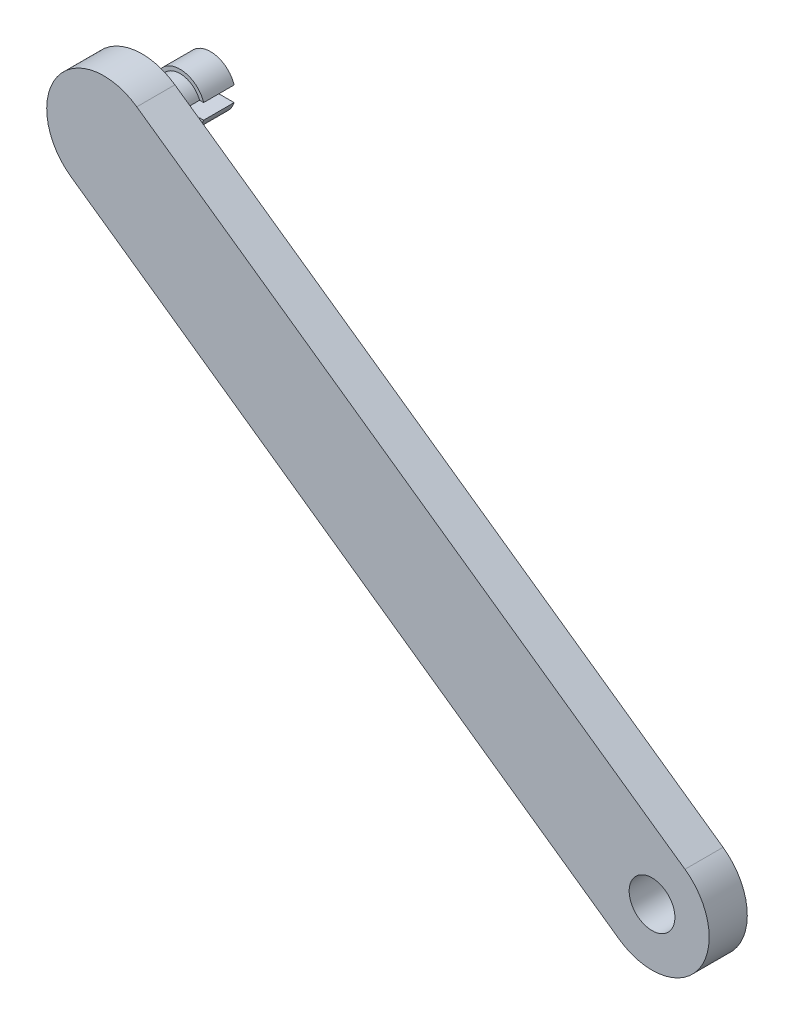
ISO-10303-21;
HEADER;
FILE_DESCRIPTION(('STEP AP214'),'2;1');
FILE_NAME('part.step','',(''),(''),'','','');
FILE_SCHEMA(('AUTOMOTIVE_DESIGN { 1 0 10303 214 1 1 1 1 }'));
ENDSEC;
DATA;
#1=APPLICATION_CONTEXT('core data for automotive mechanical design processes');
#2=APPLICATION_PROTOCOL_DEFINITION('international standard','automotive_design',2000,#1);
#3=PRODUCT_CONTEXT('',#1,'mechanical');
#4=PRODUCT('Part','Part','',(#3));
#5=PRODUCT_RELATED_PRODUCT_CATEGORY('part','',(#4));
#6=PRODUCT_DEFINITION_FORMATION('','',#4);
#7=PRODUCT_DEFINITION_CONTEXT('part definition',#1,'design');
#8=PRODUCT_DEFINITION('design','',#6,#7);
#9=PRODUCT_DEFINITION_SHAPE('','',#8);
#10=(LENGTH_UNIT() NAMED_UNIT(*) SI_UNIT(.MILLI.,.METRE.));
#11=(NAMED_UNIT(*) PLANE_ANGLE_UNIT() SI_UNIT($,.RADIAN.));
#12=(NAMED_UNIT(*) SI_UNIT($,.STERADIAN.) SOLID_ANGLE_UNIT());
#13=UNCERTAINTY_MEASURE_WITH_UNIT(LENGTH_MEASURE(1.E-05),#10,'distance_accuracy_value','');
#14=(GEOMETRIC_REPRESENTATION_CONTEXT(3) GLOBAL_UNCERTAINTY_ASSIGNED_CONTEXT((#13)) GLOBAL_UNIT_ASSIGNED_CONTEXT((#10,
#11,#12)) REPRESENTATION_CONTEXT('',''));
#15=CARTESIAN_POINT('',(0.,0.,0.));
#16=DIRECTION('',(0.,0.,1.));
#17=DIRECTION('',(1.,0.,0.));
#18=AXIS2_PLACEMENT_3D('',#15,#16,#17);
#19=CARTESIAN_POINT('',(-51.9374003115642,50.6854065428479,-5.));
#20=DIRECTION('',(0.,0.,1.));
#21=DIRECTION('',(1.,0.,0.));
#22=AXIS2_PLACEMENT_3D('',#19,#20,#21);
#23=CYLINDRICAL_SURFACE('',#22,2.75000000000001);
#24=CARTESIAN_POINT('',(-51.9374003115642,50.6854065428479,-5.));
#25=DIRECTION('',(0.,0.,-1.));
#26=DIRECTION('',(-1.,0.,0.));
#27=AXIS2_PLACEMENT_3D('',#24,#25,#26);
#28=CIRCLE('',#27,2.75000000000001);
#29=CARTESIAN_POINT('',(-54.4991380030541,51.6854065428479,-5.));
#30=VERTEX_POINT('',#29);
#31=CARTESIAN_POINT('',(-49.3756626200743,51.6854065428479,-5.));
#32=VERTEX_POINT('',#31);
#33=EDGE_CURVE('E166',#30,#32,#28,.T.);
#34=ORIENTED_EDGE('',*,*,#33,.F.);
#35=DIRECTION('',(0.,0.,1.));
#36=VECTOR('',#35,1.);
#37=CARTESIAN_POINT('',(-54.4991380030541,51.6854065428479,-5.));
#38=LINE('',#37,#36);
#39=CARTESIAN_POINT('',(-54.4991380030541,51.6854065428479,0.));
#40=VERTEX_POINT('',#39);
#41=EDGE_CURVE('E163',#30,#40,#38,.T.);
#42=ORIENTED_EDGE('',*,*,#41,.T.);
#43=CARTESIAN_POINT('',(-51.9374003115642,50.6854065428479,0.));
#44=DIRECTION('',(0.,0.,1.));
#45=DIRECTION('',(1.,0.,0.));
#46=AXIS2_PLACEMENT_3D('',#43,#44,#45);
#47=CIRCLE('',#46,2.75000000000001);
#48=CARTESIAN_POINT('',(-49.3756626200743,51.6854065428479,0.));
#49=VERTEX_POINT('',#48);
#50=EDGE_CURVE('E198',#40,#49,#47,.F.);
#51=ORIENTED_EDGE('',*,*,#50,.T.);
#52=DIRECTION('',(0.,0.,1.));
#53=VECTOR('',#52,1.);
#54=CARTESIAN_POINT('',(-49.3756626200743,51.6854065428479,-5.));
#55=LINE('',#54,#53);
#56=EDGE_CURVE('E220',#49,#32,#55,.F.);
#57=ORIENTED_EDGE('',*,*,#56,.T.);
#58=EDGE_LOOP('',(#34,#42,#51,#57));
#59=FACE_BOUND('',#58,.T.);
#60=ADVANCED_FACE('F37',(#59),#23,.T.);
#61=CARTESIAN_POINT('',(-51.9374003115642,50.6854065428479,-9.));
#62=DIRECTION('',(0.,0.,1.));
#63=DIRECTION('',(1.,0.,0.));
#64=AXIS2_PLACEMENT_3D('',#61,#62,#63);
#65=CYLINDRICAL_SURFACE('',#64,3.25000000000001);
#66=CARTESIAN_POINT('',(-51.9374003115642,50.6854065428479,-9.));
#67=DIRECTION('',(0.,0.,-1.));
#68=DIRECTION('',(-1.,0.,0.));
#69=AXIS2_PLACEMENT_3D('',#66,#67,#68);
#70=CIRCLE('',#69,3.25000000000001);
#71=CARTESIAN_POINT('',(-55.0297295307774,51.6854065428479,-9.));
#72=VERTEX_POINT('',#71);
#73=CARTESIAN_POINT('',(-48.8450710923509,51.6854065428479,-9.));
#74=VERTEX_POINT('',#73);
#75=EDGE_CURVE('E154',#72,#74,#70,.T.);
#76=ORIENTED_EDGE('',*,*,#75,.F.);
#77=DIRECTION('',(0.,0.,1.));
#78=VECTOR('',#77,1.);
#79=CARTESIAN_POINT('',(-55.0297295307774,51.6854065428479,-9.));
#80=LINE('',#79,#78);
#81=CARTESIAN_POINT('',(-55.0297295307774,51.6854065428479,-5.));
#82=VERTEX_POINT('',#81);
#83=EDGE_CURVE('E218',#72,#82,#80,.T.);
#84=ORIENTED_EDGE('',*,*,#83,.T.);
#85=CARTESIAN_POINT('',(-51.9374003115642,50.6854065428479,-5.));
#86=DIRECTION('',(0.,0.,-1.));
#87=DIRECTION('',(-1.,0.,0.));
#88=AXIS2_PLACEMENT_3D('',#85,#86,#87);
#89=CIRCLE('',#88,3.25000000000001);
#90=CARTESIAN_POINT('',(-48.8450710923509,51.6854065428479,-5.));
#91=VERTEX_POINT('',#90);
#92=EDGE_CURVE('E155',#82,#91,#89,.T.);
#93=ORIENTED_EDGE('',*,*,#92,.T.);
#94=DIRECTION('',(0.,0.,1.));
#95=VECTOR('',#94,1.);
#96=CARTESIAN_POINT('',(-48.8450710923509,51.6854065428479,-9.));
#97=LINE('',#96,#95);
#98=EDGE_CURVE('E217',#91,#74,#97,.F.);
#99=ORIENTED_EDGE('',*,*,#98,.T.);
#100=EDGE_LOOP('',(#76,#84,#93,#99));
#101=FACE_BOUND('',#100,.T.);
#102=ADVANCED_FACE('F216',(#101),#65,.T.);
#103=CARTESIAN_POINT('',(-51.9374003115642,50.6854065428479,-9.));
#104=DIRECTION('',(0.,0.,-1.));
#105=DIRECTION('',(-1.,0.,0.));
#106=AXIS2_PLACEMENT_3D('',#103,#104,#105);
#107=PLANE('',#106);
#108=DIRECTION('',(1.,0.,0.));
#109=VECTOR('',#108,1.);
#110=CARTESIAN_POINT('',(-46.9374003115642,51.6854065428479,-9.));
#111=LINE('',#110,#109);
#112=EDGE_CURVE('E151',#72,#74,#111,.T.);
#113=ORIENTED_EDGE('',*,*,#112,.F.);
#114=ORIENTED_EDGE('',*,*,#75,.T.);
#115=EDGE_LOOP('',(#113,#114));
#116=FACE_BOUND('',#115,.T.);
#117=ADVANCED_FACE('F252',(#116),#107,.T.);
#118=CARTESIAN_POINT('',(-51.9374003115642,50.6854065428479,-5.));
#119=DIRECTION('',(0.,0.,-1.));
#120=DIRECTION('',(-1.,0.,0.));
#121=AXIS2_PLACEMENT_3D('',#118,#119,#120);
#122=PLANE('',#121);
#123=ORIENTED_EDGE('',*,*,#92,.F.);
#124=DIRECTION('',(1.,0.,0.));
#125=VECTOR('',#124,1.);
#126=CARTESIAN_POINT('',(-51.9374003115642,51.6854065428479,-5.));
#127=LINE('',#126,#125);
#128=EDGE_CURVE('E11',#82,#30,#127,.T.);
#129=ORIENTED_EDGE('',*,*,#128,.T.);
#130=ORIENTED_EDGE('',*,*,#33,.T.);
#131=EDGE_CURVE('E41',#32,#91,#127,.T.);
#132=ORIENTED_EDGE('',*,*,#131,.T.);
#133=EDGE_LOOP('',(#123,#129,#130,#132));
#134=FACE_BOUND('',#133,.T.);
#135=ADVANCED_FACE('F208',(#134),#122,.F.);
#136=CARTESIAN_POINT('',(20.,0.,5.));
#137=DIRECTION('',(0.,0.,-1.));
#138=DIRECTION('',(-1.,0.,0.));
#139=AXIS2_PLACEMENT_3D('',#136,#137,#138);
#140=CYLINDRICAL_SURFACE('',#139,7.5);
#141=CARTESIAN_POINT('',(20.,0.,0.));
#142=DIRECTION('',(0.,0.,1.));
#143=DIRECTION('',(1.,0.,0.));
#144=AXIS2_PLACEMENT_3D('',#141,#142,#143);
#145=CIRCLE('',#144,7.5);
#146=CARTESIAN_POINT('',(15.68022103328,-6.13102843564467,0.));
#147=VERTEX_POINT('',#146);
#148=CARTESIAN_POINT('',(24.31977896672,6.13102843564468,0.));
#149=VERTEX_POINT('',#148);
#150=EDGE_CURVE('E173',#147,#149,#145,.T.);
#151=ORIENTED_EDGE('',*,*,#150,.T.);
#152=DIRECTION('',(0.,0.,-1.));
#153=VECTOR('',#152,1.);
#154=CARTESIAN_POINT('',(24.31977896672,6.13102843564468,5.));
#155=LINE('',#154,#153);
#156=CARTESIAN_POINT('',(24.31977896672,6.13102843564468,5.));
#157=VERTEX_POINT('',#156);
#158=EDGE_CURVE('E196',#157,#149,#155,.T.);
#159=ORIENTED_EDGE('',*,*,#158,.F.);
#160=CARTESIAN_POINT('',(20.,0.,5.));
#161=DIRECTION('',(0.,0.,1.));
#162=DIRECTION('',(1.,0.,0.));
#163=AXIS2_PLACEMENT_3D('',#160,#161,#162);
#164=CIRCLE('',#163,7.5);
#165=CARTESIAN_POINT('',(15.68022103328,-6.13102843564467,5.));
#166=VERTEX_POINT('',#165);
#167=EDGE_CURVE('E176',#166,#157,#164,.T.);
#168=ORIENTED_EDGE('',*,*,#167,.F.);
#169=DIRECTION('',(0.,0.,-1.));
#170=VECTOR('',#169,1.);
#171=CARTESIAN_POINT('',(15.68022103328,-6.13102843564467,5.));
#172=LINE('',#171,#170);
#173=EDGE_CURVE('E182',#166,#147,#172,.T.);
#174=ORIENTED_EDGE('',*,*,#173,.T.);
#175=EDGE_LOOP('',(#151,#159,#168,#174));
#176=FACE_BOUND('',#175,.T.);
#177=ADVANCED_FACE('F39',(#176),#140,.T.);
#178=CARTESIAN_POINT('',(24.31977896672,6.13102843564468,5.));
#179=DIRECTION('',(-0.575970528895999,-0.817470458085957,0.));
#180=DIRECTION('',(0.817470458085957,-0.575970528895999,0.));
#181=AXIS2_PLACEMENT_3D('',#178,#179,#180);
#182=PLANE('',#181);
#183=DIRECTION('',(-0.817470458085957,0.575970528895999,0.));
#184=VECTOR('',#183,1.);
#185=CARTESIAN_POINT('',(24.31977896672,6.13102843564468,0.));
#186=LINE('',#185,#184);
#187=CARTESIAN_POINT('',(-47.6176213448442,56.8164349784926,0.));
#188=VERTEX_POINT('',#187);
#189=EDGE_CURVE('E185',#149,#188,#186,.T.);
#190=ORIENTED_EDGE('',*,*,#189,.T.);
#191=DIRECTION('',(0.,0.,-1.));
#192=VECTOR('',#191,1.);
#193=CARTESIAN_POINT('',(-47.6176213448442,56.8164349784926,5.));
#194=LINE('',#193,#192);
#195=CARTESIAN_POINT('',(-47.6176213448442,56.8164349784926,5.));
#196=VERTEX_POINT('',#195);
#197=EDGE_CURVE('E193',#196,#188,#194,.T.);
#198=ORIENTED_EDGE('',*,*,#197,.F.);
#199=DIRECTION('',(-0.817470458085957,0.575970528895999,0.));
#200=VECTOR('',#199,1.);
#201=CARTESIAN_POINT('',(24.31977896672,6.13102843564468,5.));
#202=LINE('',#201,#200);
#203=EDGE_CURVE('E90',#157,#196,#202,.T.);
#204=ORIENTED_EDGE('',*,*,#203,.F.);
#205=ORIENTED_EDGE('',*,*,#158,.T.);
#206=EDGE_LOOP('',(#190,#198,#204,#205));
#207=FACE_BOUND('',#206,.T.);
#208=ADVANCED_FACE('F286',(#207),#182,.F.);
#209=CARTESIAN_POINT('',(-51.9374003115642,50.6854065428479,5.));
#210=DIRECTION('',(0.,0.,-1.));
#211=DIRECTION('',(-1.,0.,0.));
#212=AXIS2_PLACEMENT_3D('',#209,#210,#211);
#213=CYLINDRICAL_SURFACE('',#212,7.5);
#214=CARTESIAN_POINT('',(-51.9374003115642,50.6854065428479,0.));
#215=DIRECTION('',(0.,0.,1.));
#216=DIRECTION('',(1.,0.,0.));
#217=AXIS2_PLACEMENT_3D('',#214,#215,#216);
#218=CIRCLE('',#217,7.5);
#219=CARTESIAN_POINT('',(-56.2571792782842,44.5543781072032,0.));
#220=VERTEX_POINT('',#219);
#221=EDGE_CURVE('E187',#188,#220,#218,.T.);
#222=ORIENTED_EDGE('',*,*,#221,.T.);
#223=DIRECTION('',(0.,0.,-1.));
#224=VECTOR('',#223,1.);
#225=CARTESIAN_POINT('',(-56.2571792782842,44.5543781072032,5.));
#226=LINE('',#225,#224);
#227=CARTESIAN_POINT('',(-56.2571792782842,44.5543781072032,5.));
#228=VERTEX_POINT('',#227);
#229=EDGE_CURVE('E191',#228,#220,#226,.T.);
#230=ORIENTED_EDGE('',*,*,#229,.F.);
#231=CARTESIAN_POINT('',(-51.9374003115642,50.6854065428479,5.));
#232=DIRECTION('',(0.,0.,1.));
#233=DIRECTION('',(1.,0.,0.));
#234=AXIS2_PLACEMENT_3D('',#231,#232,#233);
#235=CIRCLE('',#234,7.5);
#236=EDGE_CURVE('E179',#196,#228,#235,.T.);
#237=ORIENTED_EDGE('',*,*,#236,.F.);
#238=ORIENTED_EDGE('',*,*,#197,.T.);
#239=EDGE_LOOP('',(#222,#230,#237,#238));
#240=FACE_BOUND('',#239,.T.);
#241=ADVANCED_FACE('F284',(#240),#213,.T.);
#242=CARTESIAN_POINT('',(15.68022103328,-6.13102843564467,5.));
#243=DIRECTION('',(0.575970528895999,0.817470458085957,0.));
#244=DIRECTION('',(-0.817470458085957,0.575970528895999,0.));
#245=AXIS2_PLACEMENT_3D('',#242,#243,#244);
#246=PLANE('',#245);
#247=DIRECTION('',(0.817470458085957,-0.575970528895999,0.));
#248=VECTOR('',#247,1.);
#249=CARTESIAN_POINT('',(15.68022103328,-6.13102843564467,0.));
#250=LINE('',#249,#248);
#251=EDGE_CURVE('E82',#220,#147,#250,.T.);
#252=ORIENTED_EDGE('',*,*,#251,.T.);
#253=ORIENTED_EDGE('',*,*,#173,.F.);
#254=DIRECTION('',(0.817470458085957,-0.575970528895999,0.));
#255=VECTOR('',#254,1.);
#256=CARTESIAN_POINT('',(15.68022103328,-6.13102843564467,5.));
#257=LINE('',#256,#255);
#258=EDGE_CURVE('E61',#228,#166,#257,.T.);
#259=ORIENTED_EDGE('',*,*,#258,.F.);
#260=ORIENTED_EDGE('',*,*,#229,.T.);
#261=EDGE_LOOP('',(#252,#253,#259,#260));
#262=FACE_BOUND('',#261,.T.);
#263=ADVANCED_FACE('F279',(#262),#246,.F.);
#264=CARTESIAN_POINT('',(20.,0.,5.));
#265=DIRECTION('',(0.,0.,1.));
#266=DIRECTION('',(1.,0.,0.));
#267=AXIS2_PLACEMENT_3D('',#264,#265,#266);
#268=PLANE('',#267);
#269=CARTESIAN_POINT('',(20.,0.,5.));
#270=DIRECTION('',(0.,0.,1.));
#271=DIRECTION('',(1.,0.,0.));
#272=AXIS2_PLACEMENT_3D('',#269,#270,#271);
#273=CIRCLE('',#272,3.);
#274=CARTESIAN_POINT('',(23.,0.,5.));
#275=VERTEX_POINT('',#274);
#276=EDGE_CURVE('E169',#275,#275,#273,.T.);
#277=ORIENTED_EDGE('',*,*,#276,.F.);
#278=EDGE_LOOP('',(#277));
#279=FACE_BOUND('',#278,.T.);
#280=ORIENTED_EDGE('',*,*,#167,.T.);
#281=ORIENTED_EDGE('',*,*,#203,.T.);
#282=ORIENTED_EDGE('',*,*,#236,.T.);
#283=ORIENTED_EDGE('',*,*,#258,.T.);
#284=EDGE_LOOP('',(#280,#281,#282,#283));
#285=FACE_BOUND('',#284,.T.);
#286=ADVANCED_FACE('F272',(#279,#285),#268,.T.);
#287=CARTESIAN_POINT('',(20.,0.,0.));
#288=DIRECTION('',(0.,0.,1.));
#289=DIRECTION('',(1.,0.,0.));
#290=AXIS2_PLACEMENT_3D('',#287,#288,#289);
#291=PLANE('',#290);
#292=DIRECTION('',(1.,0.,0.));
#293=VECTOR('',#292,1.);
#294=CARTESIAN_POINT('',(-46.9374003115642,51.6854065428479,0.));
#295=LINE('',#294,#293);
#296=EDGE_CURVE('E230',#40,#49,#295,.T.);
#297=ORIENTED_EDGE('',*,*,#296,.T.);
#298=ORIENTED_EDGE('',*,*,#50,.F.);
#299=EDGE_LOOP('',(#297,#298));
#300=FACE_BOUND('',#299,.T.);
#301=DIRECTION('',(-1.,0.,0.));
#302=VECTOR('',#301,1.);
#303=CARTESIAN_POINT('',(-46.9374003115642,49.6854065428479,0.));
#304=LINE('',#303,#302);
#305=CARTESIAN_POINT('',(-49.3756626200743,49.6854065428479,0.));
#306=VERTEX_POINT('',#305);
#307=CARTESIAN_POINT('',(-54.4991380030541,49.6854065428479,0.));
#308=VERTEX_POINT('',#307);
#309=EDGE_CURVE('E231',#306,#308,#304,.T.);
#310=ORIENTED_EDGE('',*,*,#309,.T.);
#311=EDGE_CURVE('E199',#306,#308,#47,.F.);
#312=ORIENTED_EDGE('',*,*,#311,.F.);
#313=EDGE_LOOP('',(#310,#312));
#314=FACE_BOUND('',#313,.T.);
#315=CARTESIAN_POINT('',(20.,0.,0.));
#316=DIRECTION('',(0.,0.,1.));
#317=DIRECTION('',(1.,0.,0.));
#318=AXIS2_PLACEMENT_3D('',#315,#316,#317);
#319=CIRCLE('',#318,3.);
#320=CARTESIAN_POINT('',(23.,0.,0.));
#321=VERTEX_POINT('',#320);
#322=EDGE_CURVE('E170',#321,#321,#319,.T.);
#323=ORIENTED_EDGE('',*,*,#322,.T.);
#324=EDGE_LOOP('',(#323));
#325=FACE_BOUND('',#324,.T.);
#326=ORIENTED_EDGE('',*,*,#150,.F.);
#327=ORIENTED_EDGE('',*,*,#251,.F.);
#328=ORIENTED_EDGE('',*,*,#221,.F.);
#329=ORIENTED_EDGE('',*,*,#189,.F.);
#330=EDGE_LOOP('',(#326,#327,#328,#329));
#331=FACE_BOUND('',#330,.T.);
#332=ADVANCED_FACE('F238',(#300,#314,#325,#331),#291,.F.);
#333=CARTESIAN_POINT('',(20.,0.,0.));
#334=DIRECTION('',(0.,0.,1.));
#335=DIRECTION('',(1.,0.,0.));
#336=AXIS2_PLACEMENT_3D('',#333,#334,#335);
#337=CYLINDRICAL_SURFACE('',#336,3.);
#338=ORIENTED_EDGE('',*,*,#322,.F.);
#339=EDGE_LOOP('',(#338));
#340=FACE_BOUND('',#339,.T.);
#341=ORIENTED_EDGE('',*,*,#276,.T.);
#342=EDGE_LOOP('',(#341));
#343=FACE_BOUND('',#342,.T.);
#344=ADVANCED_FACE('F263',(#340,#343),#337,.F.);
#345=CARTESIAN_POINT('',(-49.3756626200743,49.6854065428479,-5.));
#346=VERTEX_POINT('',#345);
#347=CARTESIAN_POINT('',(-54.4991380030541,49.6854065428479,-5.));
#348=VERTEX_POINT('',#347);
#349=EDGE_CURVE('E158',#346,#348,#28,.T.);
#350=ORIENTED_EDGE('',*,*,#349,.F.);
#351=DIRECTION('',(0.,0.,1.));
#352=VECTOR('',#351,1.);
#353=CARTESIAN_POINT('',(-49.3756626200743,49.6854065428479,-5.));
#354=LINE('',#353,#352);
#355=EDGE_CURVE('E144',#346,#306,#354,.T.);
#356=ORIENTED_EDGE('',*,*,#355,.T.);
#357=ORIENTED_EDGE('',*,*,#311,.T.);
#358=DIRECTION('',(0.,0.,1.));
#359=VECTOR('',#358,1.);
#360=CARTESIAN_POINT('',(-54.4991380030541,49.6854065428479,-5.));
#361=LINE('',#360,#359);
#362=EDGE_CURVE('E145',#308,#348,#361,.F.);
#363=ORIENTED_EDGE('',*,*,#362,.T.);
#364=EDGE_LOOP('',(#350,#356,#357,#363));
#365=FACE_BOUND('',#364,.T.);
#366=ADVANCED_FACE('F241',(#365),#23,.T.);
#367=CARTESIAN_POINT('',(-48.8450710923509,49.6854065428479,-9.));
#368=VERTEX_POINT('',#367);
#369=CARTESIAN_POINT('',(-55.0297295307774,49.6854065428479,-9.));
#370=VERTEX_POINT('',#369);
#371=EDGE_CURVE('E150',#368,#370,#70,.T.);
#372=ORIENTED_EDGE('',*,*,#371,.F.);
#373=DIRECTION('',(0.,0.,1.));
#374=VECTOR('',#373,1.);
#375=CARTESIAN_POINT('',(-48.8450710923509,49.6854065428479,-9.));
#376=LINE('',#375,#374);
#377=CARTESIAN_POINT('',(-48.8450710923509,49.6854065428479,-5.));
#378=VERTEX_POINT('',#377);
#379=EDGE_CURVE('E134',#368,#378,#376,.T.);
#380=ORIENTED_EDGE('',*,*,#379,.T.);
#381=CARTESIAN_POINT('',(-55.0297295307774,49.6854065428479,-5.));
#382=VERTEX_POINT('',#381);
#383=EDGE_CURVE('E160',#378,#382,#89,.T.);
#384=ORIENTED_EDGE('',*,*,#383,.T.);
#385=DIRECTION('',(0.,0.,1.));
#386=VECTOR('',#385,1.);
#387=CARTESIAN_POINT('',(-55.0297295307774,49.6854065428479,-9.));
#388=LINE('',#387,#386);
#389=EDGE_CURVE('E52',#382,#370,#388,.F.);
#390=ORIENTED_EDGE('',*,*,#389,.T.);
#391=EDGE_LOOP('',(#372,#380,#384,#390));
#392=FACE_BOUND('',#391,.T.);
#393=ADVANCED_FACE('F153',(#392),#65,.T.);
#394=DIRECTION('',(-1.,0.,0.));
#395=VECTOR('',#394,1.);
#396=CARTESIAN_POINT('',(-46.9374003115642,49.6854065428479,-9.));
#397=LINE('',#396,#395);
#398=EDGE_CURVE('E137',#368,#370,#397,.T.);
#399=ORIENTED_EDGE('',*,*,#398,.F.);
#400=ORIENTED_EDGE('',*,*,#371,.T.);
#401=EDGE_LOOP('',(#399,#400));
#402=FACE_BOUND('',#401,.T.);
#403=ADVANCED_FACE('F149',(#402),#107,.T.);
#404=ORIENTED_EDGE('',*,*,#383,.F.);
#405=DIRECTION('',(-1.,0.,0.));
#406=VECTOR('',#405,1.);
#407=CARTESIAN_POINT('',(-51.9374003115642,49.6854065428479,-5.));
#408=LINE('',#407,#406);
#409=EDGE_CURVE('E139',#378,#346,#408,.T.);
#410=ORIENTED_EDGE('',*,*,#409,.T.);
#411=ORIENTED_EDGE('',*,*,#349,.T.);
#412=EDGE_CURVE('E201',#348,#382,#408,.T.);
#413=ORIENTED_EDGE('',*,*,#412,.T.);
#414=EDGE_LOOP('',(#404,#410,#411,#413));
#415=FACE_BOUND('',#414,.T.);
#416=ADVANCED_FACE('F242',(#415),#122,.F.);
#417=CARTESIAN_POINT('',(-46.9374003115642,51.6854065428479,0.));
#418=DIRECTION('',(0.,1.,0.));
#419=DIRECTION('',(0.,0.,1.));
#420=AXIS2_PLACEMENT_3D('',#417,#418,#419);
#421=PLANE('',#420);
#422=ORIENTED_EDGE('',*,*,#128,.F.);
#423=ORIENTED_EDGE('',*,*,#83,.F.);
#424=ORIENTED_EDGE('',*,*,#112,.T.);
#425=ORIENTED_EDGE('',*,*,#98,.F.);
#426=ORIENTED_EDGE('',*,*,#131,.F.);
#427=ORIENTED_EDGE('',*,*,#56,.F.);
#428=ORIENTED_EDGE('',*,*,#296,.F.);
#429=ORIENTED_EDGE('',*,*,#41,.F.);
#430=EDGE_LOOP('',(#422,#423,#424,#425,#426,#427,#428,#429));
#431=FACE_BOUND('',#430,.T.);
#432=ADVANCED_FACE('F244',(#431),#421,.F.);
#433=CARTESIAN_POINT('',(-46.9374003115642,49.6854065428479,0.));
#434=DIRECTION('',(0.,-1.,0.));
#435=DIRECTION('',(0.,0.,-1.));
#436=AXIS2_PLACEMENT_3D('',#433,#434,#435);
#437=PLANE('',#436);
#438=ORIENTED_EDGE('',*,*,#409,.F.);
#439=ORIENTED_EDGE('',*,*,#379,.F.);
#440=ORIENTED_EDGE('',*,*,#398,.T.);
#441=ORIENTED_EDGE('',*,*,#389,.F.);
#442=ORIENTED_EDGE('',*,*,#412,.F.);
#443=ORIENTED_EDGE('',*,*,#362,.F.);
#444=ORIENTED_EDGE('',*,*,#309,.F.);
#445=ORIENTED_EDGE('',*,*,#355,.F.);
#446=EDGE_LOOP('',(#438,#439,#440,#441,#442,#443,#444,#445));
#447=FACE_BOUND('',#446,.T.);
#448=ADVANCED_FACE('F136',(#447),#437,.F.);
#449=CLOSED_SHELL('',(#60,#102,#117,#135,#177,#208,#241,#263,#286,#332,#344,#366,#393,#403,#416,
#432,#448));
#450=MANIFOLD_SOLID_BREP('B2',#449);
#451=ADVANCED_BREP_SHAPE_REPRESENTATION('',(#18,#450),#14);
#452=SHAPE_DEFINITION_REPRESENTATION(#9,#451);
ENDSEC;
END-ISO-10303-21;
